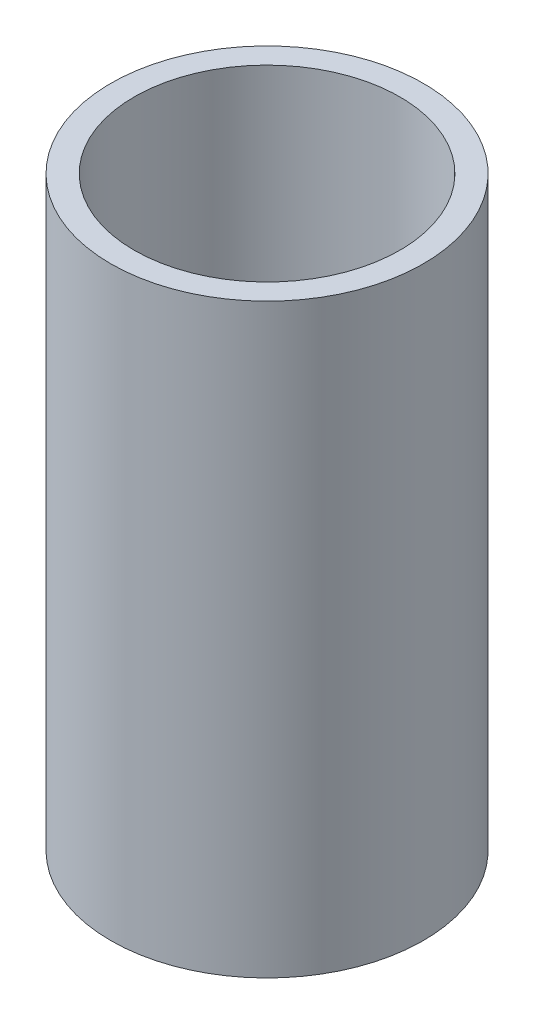
ISO-10303-21;
HEADER;
FILE_DESCRIPTION(('STEP AP214'),'2;1');
FILE_NAME('part.step','',(''),(''),'','','');
FILE_SCHEMA(('AUTOMOTIVE_DESIGN { 1 0 10303 214 1 1 1 1 }'));
ENDSEC;
DATA;
#1=APPLICATION_CONTEXT('core data for automotive mechanical design processes');
#2=APPLICATION_PROTOCOL_DEFINITION('international standard','automotive_design',2000,#1);
#3=PRODUCT_CONTEXT('',#1,'mechanical');
#4=PRODUCT('Part','Part','',(#3));
#5=PRODUCT_RELATED_PRODUCT_CATEGORY('part','',(#4));
#6=PRODUCT_DEFINITION_FORMATION('','',#4);
#7=PRODUCT_DEFINITION_CONTEXT('part definition',#1,'design');
#8=PRODUCT_DEFINITION('design','',#6,#7);
#9=PRODUCT_DEFINITION_SHAPE('','',#8);
#10=(LENGTH_UNIT() NAMED_UNIT(*) SI_UNIT(.MILLI.,.METRE.));
#11=(NAMED_UNIT(*) PLANE_ANGLE_UNIT() SI_UNIT($,.RADIAN.));
#12=(NAMED_UNIT(*) SI_UNIT($,.STERADIAN.) SOLID_ANGLE_UNIT());
#13=UNCERTAINTY_MEASURE_WITH_UNIT(LENGTH_MEASURE(1.E-05),#10,'distance_accuracy_value','');
#14=(GEOMETRIC_REPRESENTATION_CONTEXT(3) GLOBAL_UNCERTAINTY_ASSIGNED_CONTEXT((#13)) GLOBAL_UNIT_ASSIGNED_CONTEXT((#10,
#11,#12)) REPRESENTATION_CONTEXT('',''));
#15=CARTESIAN_POINT('',(0.,0.,0.));
#16=DIRECTION('',(0.,0.,1.));
#17=DIRECTION('',(1.,0.,0.));
#18=AXIS2_PLACEMENT_3D('',#15,#16,#17);
#19=CARTESIAN_POINT('',(0.,60.,0.));
#20=DIRECTION('',(0.,1.,0.));
#21=DIRECTION('',(0.,0.,1.));
#22=AXIS2_PLACEMENT_3D('',#19,#20,#21);
#23=PLANE('',#22);
#24=CARTESIAN_POINT('',(0.,60.,0.));
#25=DIRECTION('',(0.,1.,0.));
#26=DIRECTION('',(0.,0.,1.));
#27=AXIS2_PLACEMENT_3D('',#24,#25,#26);
#28=CIRCLE('',#27,16.);
#29=CARTESIAN_POINT('',(0.,60.,16.));
#30=VERTEX_POINT('',#29);
#31=EDGE_CURVE('E10',#30,#30,#28,.T.);
#32=ORIENTED_EDGE('',*,*,#31,.T.);
#33=EDGE_LOOP('',(#32));
#34=FACE_BOUND('',#33,.T.);
#35=CARTESIAN_POINT('',(0.,60.,0.));
#36=DIRECTION('',(0.,1.,0.));
#37=DIRECTION('',(0.,0.,1.));
#38=AXIS2_PLACEMENT_3D('',#35,#36,#37);
#39=CIRCLE('',#38,13.6);
#40=CARTESIAN_POINT('',(0.,60.,13.6));
#41=VERTEX_POINT('',#40);
#42=EDGE_CURVE('E48',#41,#41,#39,.T.);
#43=ORIENTED_EDGE('',*,*,#42,.F.);
#44=EDGE_LOOP('',(#43));
#45=FACE_BOUND('',#44,.T.);
#46=ADVANCED_FACE('F37',(#34,#45),#23,.T.);
#47=CARTESIAN_POINT('',(0.,0.,0.));
#48=DIRECTION('',(0.,1.,0.));
#49=DIRECTION('',(0.,0.,1.));
#50=AXIS2_PLACEMENT_3D('',#47,#48,#49);
#51=PLANE('',#50);
#52=CARTESIAN_POINT('',(0.,0.,0.));
#53=DIRECTION('',(0.,1.,0.));
#54=DIRECTION('',(0.,0.,1.));
#55=AXIS2_PLACEMENT_3D('',#52,#53,#54);
#56=CIRCLE('',#55,16.);
#57=CARTESIAN_POINT('',(0.,0.,16.));
#58=VERTEX_POINT('',#57);
#59=EDGE_CURVE('E41',#58,#58,#56,.T.);
#60=ORIENTED_EDGE('',*,*,#59,.F.);
#61=EDGE_LOOP('',(#60));
#62=FACE_BOUND('',#61,.T.);
#63=CARTESIAN_POINT('',(0.,0.,0.));
#64=DIRECTION('',(0.,1.,0.));
#65=DIRECTION('',(0.,0.,1.));
#66=AXIS2_PLACEMENT_3D('',#63,#64,#65);
#67=CIRCLE('',#66,13.6);
#68=CARTESIAN_POINT('',(0.,0.,13.6));
#69=VERTEX_POINT('',#68);
#70=EDGE_CURVE('E50',#69,#69,#67,.T.);
#71=ORIENTED_EDGE('',*,*,#70,.T.);
#72=EDGE_LOOP('',(#71));
#73=FACE_BOUND('',#72,.T.);
#74=ADVANCED_FACE('F60',(#62,#73),#51,.F.);
#75=CARTESIAN_POINT('',(0.,60.,0.));
#76=DIRECTION('',(0.,-1.,0.));
#77=DIRECTION('',(0.,0.,-1.));
#78=AXIS2_PLACEMENT_3D('',#75,#76,#77);
#79=CYLINDRICAL_SURFACE('',#78,16.);
#80=ORIENTED_EDGE('',*,*,#31,.F.);
#81=EDGE_LOOP('',(#80));
#82=FACE_BOUND('',#81,.T.);
#83=ORIENTED_EDGE('',*,*,#59,.T.);
#84=EDGE_LOOP('',(#83));
#85=FACE_BOUND('',#84,.T.);
#86=ADVANCED_FACE('F39',(#82,#85),#79,.T.);
#87=CARTESIAN_POINT('',(0.,60.,0.));
#88=DIRECTION('',(0.,-1.,0.));
#89=DIRECTION('',(0.,0.,-1.));
#90=AXIS2_PLACEMENT_3D('',#87,#88,#89);
#91=CYLINDRICAL_SURFACE('',#90,13.6);
#92=ORIENTED_EDGE('',*,*,#42,.T.);
#93=EDGE_LOOP('',(#92));
#94=FACE_BOUND('',#93,.T.);
#95=ORIENTED_EDGE('',*,*,#70,.F.);
#96=EDGE_LOOP('',(#95));
#97=FACE_BOUND('',#96,.T.);
#98=ADVANCED_FACE('F56',(#94,#97),#91,.F.);
#99=CLOSED_SHELL('',(#46,#74,#86,#98));
#100=MANIFOLD_SOLID_BREP('B2',#99);
#101=ADVANCED_BREP_SHAPE_REPRESENTATION('',(#18,#100),#14);
#102=SHAPE_DEFINITION_REPRESENTATION(#9,#101);
ENDSEC;
END-ISO-10303-21;
